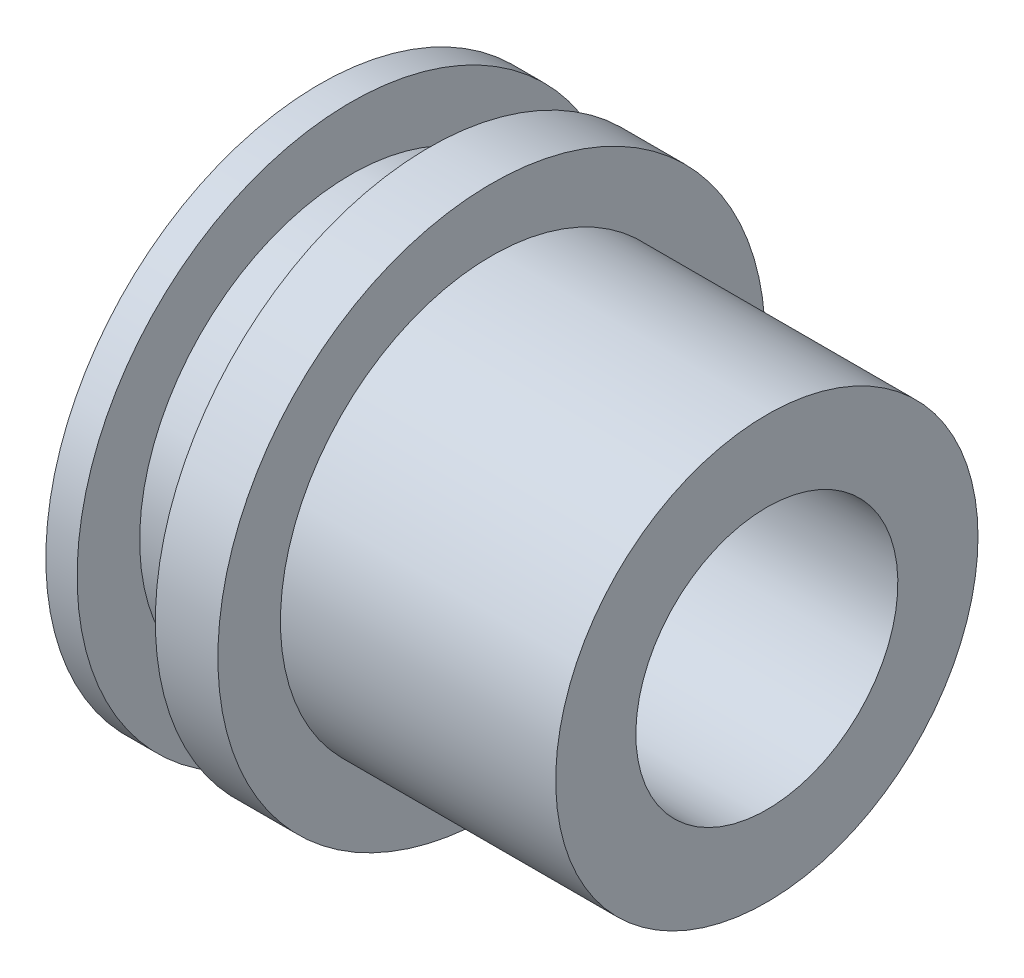
ISO-10303-21;
HEADER;
FILE_DESCRIPTION(('STEP AP214'),'2;1');
FILE_NAME('part.step','',(''),(''),'','','');
FILE_SCHEMA(('AUTOMOTIVE_DESIGN { 1 0 10303 214 1 1 1 1 }'));
ENDSEC;
DATA;
#1=APPLICATION_CONTEXT('core data for automotive mechanical design processes');
#2=APPLICATION_PROTOCOL_DEFINITION('international standard','automotive_design',2000,#1);
#3=PRODUCT_CONTEXT('',#1,'mechanical');
#4=PRODUCT('Part','Part','',(#3));
#5=PRODUCT_RELATED_PRODUCT_CATEGORY('part','',(#4));
#6=PRODUCT_DEFINITION_FORMATION('','',#4);
#7=PRODUCT_DEFINITION_CONTEXT('part definition',#1,'design');
#8=PRODUCT_DEFINITION('design','',#6,#7);
#9=PRODUCT_DEFINITION_SHAPE('','',#8);
#10=(LENGTH_UNIT() NAMED_UNIT(*) SI_UNIT(.MILLI.,.METRE.));
#11=(NAMED_UNIT(*) PLANE_ANGLE_UNIT() SI_UNIT($,.RADIAN.));
#12=(NAMED_UNIT(*) SI_UNIT($,.STERADIAN.) SOLID_ANGLE_UNIT());
#13=UNCERTAINTY_MEASURE_WITH_UNIT(LENGTH_MEASURE(1.E-05),#10,'distance_accuracy_value','');
#14=(GEOMETRIC_REPRESENTATION_CONTEXT(3) GLOBAL_UNCERTAINTY_ASSIGNED_CONTEXT((#13)) GLOBAL_UNIT_ASSIGNED_CONTEXT((#10,
#11,#12)) REPRESENTATION_CONTEXT('',''));
#15=CARTESIAN_POINT('',(0.,0.,0.));
#16=DIRECTION('',(0.,0.,1.));
#17=DIRECTION('',(1.,0.,0.));
#18=AXIS2_PLACEMENT_3D('',#15,#16,#17);
#19=CARTESIAN_POINT('',(0.499999999999999,0.,0.));
#20=DIRECTION('',(1.,0.,0.));
#21=DIRECTION('',(0.,0.,-1.));
#22=AXIS2_PLACEMENT_3D('',#19,#20,#21);
#23=CYLINDRICAL_SURFACE('',#22,8.75);
#24=CARTESIAN_POINT('',(0.,0.,0.));
#25=DIRECTION('',(1.,0.,0.));
#26=DIRECTION('',(0.,0.,-1.));
#27=AXIS2_PLACEMENT_3D('',#24,#25,#26);
#28=CIRCLE('',#27,8.75);
#29=CARTESIAN_POINT('',(0.,0.,-8.75));
#30=VERTEX_POINT('',#29);
#31=EDGE_CURVE('E19',#30,#30,#28,.F.);
#32=ORIENTED_EDGE('',*,*,#31,.F.);
#33=EDGE_LOOP('',(#32));
#34=FACE_BOUND('',#33,.T.);
#35=CARTESIAN_POINT('',(0.999999999999999,0.,0.));
#36=DIRECTION('',(1.,0.,0.));
#37=DIRECTION('',(0.,0.,-1.));
#38=AXIS2_PLACEMENT_3D('',#35,#36,#37);
#39=CIRCLE('',#38,8.75);
#40=CARTESIAN_POINT('',(0.999999999999999,0.,-8.75));
#41=VERTEX_POINT('',#40);
#42=EDGE_CURVE('E53',#41,#41,#39,.T.);
#43=ORIENTED_EDGE('',*,*,#42,.F.);
#44=EDGE_LOOP('',(#43));
#45=FACE_BOUND('',#44,.T.);
#46=ADVANCED_FACE('F15',(#34,#45),#23,.T.);
#47=CARTESIAN_POINT('',(0.,4.375,0.));
#48=DIRECTION('',(-1.,0.,0.));
#49=DIRECTION('',(0.,0.,1.));
#50=AXIS2_PLACEMENT_3D('',#47,#48,#49);
#51=PLANE('',#50);
#52=CARTESIAN_POINT('',(0.,0.,0.));
#53=DIRECTION('',(1.,0.,0.));
#54=DIRECTION('',(0.,0.,-1.));
#55=AXIS2_PLACEMENT_3D('',#52,#53,#54);
#56=CIRCLE('',#55,5.75);
#57=CARTESIAN_POINT('',(0.,0.,-5.75));
#58=VERTEX_POINT('',#57);
#59=EDGE_CURVE('E51',#58,#58,#56,.T.);
#60=ORIENTED_EDGE('',*,*,#59,.T.);
#61=EDGE_LOOP('',(#60));
#62=FACE_BOUND('',#61,.T.);
#63=ORIENTED_EDGE('',*,*,#31,.T.);
#64=EDGE_LOOP('',(#63));
#65=FACE_BOUND('',#64,.T.);
#66=ADVANCED_FACE('F60',(#62,#65),#51,.T.);
#67=CARTESIAN_POINT('',(0.999999999999999,7.75,0.));
#68=DIRECTION('',(1.,0.,0.));
#69=DIRECTION('',(0.,0.,-1.));
#70=AXIS2_PLACEMENT_3D('',#67,#68,#69);
#71=PLANE('',#70);
#72=CARTESIAN_POINT('',(0.999999999999999,0.,0.));
#73=DIRECTION('',(1.,0.,0.));
#74=DIRECTION('',(0.,0.,-1.));
#75=AXIS2_PLACEMENT_3D('',#72,#73,#74);
#76=CIRCLE('',#75,6.75);
#77=CARTESIAN_POINT('',(0.999999999999999,0.,-6.75));
#78=VERTEX_POINT('',#77);
#79=EDGE_CURVE('E48',#78,#78,#76,.T.);
#80=ORIENTED_EDGE('',*,*,#79,.F.);
#81=EDGE_LOOP('',(#80));
#82=FACE_BOUND('',#81,.T.);
#83=ORIENTED_EDGE('',*,*,#42,.T.);
#84=EDGE_LOOP('',(#83));
#85=FACE_BOUND('',#84,.T.);
#86=ADVANCED_FACE('F69',(#82,#85),#71,.T.);
#87=CARTESIAN_POINT('',(0.,0.,0.));
#88=DIRECTION('',(1.,0.,0.));
#89=DIRECTION('',(0.,0.,-1.));
#90=AXIS2_PLACEMENT_3D('',#87,#88,#89);
#91=CYLINDRICAL_SURFACE('',#90,5.75);
#92=CARTESIAN_POINT('',(4.5,0.,0.));
#93=DIRECTION('',(1.,0.,0.));
#94=DIRECTION('',(0.,0.,-1.));
#95=AXIS2_PLACEMENT_3D('',#92,#93,#94);
#96=CIRCLE('',#95,5.75);
#97=CARTESIAN_POINT('',(4.5,0.,-5.75));
#98=VERTEX_POINT('',#97);
#99=EDGE_CURVE('E45',#98,#98,#96,.T.);
#100=ORIENTED_EDGE('',*,*,#99,.T.);
#101=EDGE_LOOP('',(#100));
#102=FACE_BOUND('',#101,.T.);
#103=ORIENTED_EDGE('',*,*,#59,.F.);
#104=EDGE_LOOP('',(#103));
#105=FACE_BOUND('',#104,.T.);
#106=ADVANCED_FACE('F100',(#102,#105),#91,.F.);
#107=CARTESIAN_POINT('',(2.25,0.,0.));
#108=DIRECTION('',(1.,0.,0.));
#109=DIRECTION('',(0.,0.,-1.));
#110=AXIS2_PLACEMENT_3D('',#107,#108,#109);
#111=CYLINDRICAL_SURFACE('',#110,6.75);
#112=ORIENTED_EDGE('',*,*,#79,.T.);
#113=EDGE_LOOP('',(#112));
#114=FACE_BOUND('',#113,.T.);
#115=CARTESIAN_POINT('',(3.5,0.,0.));
#116=DIRECTION('',(1.,0.,0.));
#117=DIRECTION('',(0.,0.,-1.));
#118=AXIS2_PLACEMENT_3D('',#115,#116,#117);
#119=CIRCLE('',#118,6.75);
#120=CARTESIAN_POINT('',(3.5,0.,-6.75));
#121=VERTEX_POINT('',#120);
#122=EDGE_CURVE('E42',#121,#121,#119,.T.);
#123=ORIENTED_EDGE('',*,*,#122,.F.);
#124=EDGE_LOOP('',(#123));
#125=FACE_BOUND('',#124,.T.);
#126=ADVANCED_FACE('F97',(#114,#125),#111,.T.);
#127=CARTESIAN_POINT('',(4.5,5.865,-5.865));
#128=DIRECTION('',(1.,0.,0.));
#129=DIRECTION('',(0.,0.,1.));
#130=AXIS2_PLACEMENT_3D('',#127,#128,#129);
#131=PLANE('',#130);
#132=CARTESIAN_POINT('',(4.5,0.,0.));
#133=DIRECTION('',(1.,0.,0.));
#134=DIRECTION('',(0.,1.,0.));
#135=AXIS2_PLACEMENT_3D('',#132,#133,#134);
#136=CIRCLE('',#135,4.188);
#137=CARTESIAN_POINT('',(4.5,4.188,0.));
#138=VERTEX_POINT('',#137);
#139=EDGE_CURVE('E39',#138,#138,#136,.T.);
#140=ORIENTED_EDGE('',*,*,#139,.T.);
#141=EDGE_LOOP('',(#140));
#142=FACE_BOUND('',#141,.T.);
#143=ORIENTED_EDGE('',*,*,#99,.F.);
#144=EDGE_LOOP('',(#143));
#145=FACE_BOUND('',#144,.T.);
#146=ADVANCED_FACE('F95',(#142,#145),#131,.F.);
#147=CARTESIAN_POINT('',(3.5,7.75,0.));
#148=DIRECTION('',(-1.,0.,0.));
#149=DIRECTION('',(0.,0.,1.));
#150=AXIS2_PLACEMENT_3D('',#147,#148,#149);
#151=PLANE('',#150);
#152=ORIENTED_EDGE('',*,*,#122,.T.);
#153=EDGE_LOOP('',(#152));
#154=FACE_BOUND('',#153,.T.);
#155=CARTESIAN_POINT('',(3.5,0.,0.));
#156=DIRECTION('',(1.,0.,0.));
#157=DIRECTION('',(0.,0.,-1.));
#158=AXIS2_PLACEMENT_3D('',#155,#156,#157);
#159=CIRCLE('',#158,8.75);
#160=CARTESIAN_POINT('',(3.5,0.,-8.75));
#161=VERTEX_POINT('',#160);
#162=EDGE_CURVE('E36',#161,#161,#159,.T.);
#163=ORIENTED_EDGE('',*,*,#162,.F.);
#164=EDGE_LOOP('',(#163));
#165=FACE_BOUND('',#164,.T.);
#166=ADVANCED_FACE('F92',(#154,#165),#151,.T.);
#167=CARTESIAN_POINT('',(4.5,0.,0.));
#168=DIRECTION('',(1.,0.,0.));
#169=DIRECTION('',(0.,1.,0.));
#170=AXIS2_PLACEMENT_3D('',#167,#168,#169);
#171=CYLINDRICAL_SURFACE('',#170,4.188);
#172=ORIENTED_EDGE('',*,*,#139,.F.);
#173=EDGE_LOOP('',(#172));
#174=FACE_BOUND('',#173,.T.);
#175=CARTESIAN_POINT('',(14.3,0.,0.));
#176=DIRECTION('',(1.,0.,0.));
#177=DIRECTION('',(0.,1.,0.));
#178=AXIS2_PLACEMENT_3D('',#175,#176,#177);
#179=CIRCLE('',#178,4.188);
#180=CARTESIAN_POINT('',(14.3,4.188,0.));
#181=VERTEX_POINT('',#180);
#182=EDGE_CURVE('E33',#181,#181,#179,.F.);
#183=ORIENTED_EDGE('',*,*,#182,.F.);
#184=EDGE_LOOP('',(#183));
#185=FACE_BOUND('',#184,.T.);
#186=ADVANCED_FACE('F17',(#174,#185),#171,.F.);
#187=CARTESIAN_POINT('',(4.5,0.,0.));
#188=DIRECTION('',(1.,0.,0.));
#189=DIRECTION('',(0.,0.,-1.));
#190=AXIS2_PLACEMENT_3D('',#187,#188,#189);
#191=CYLINDRICAL_SURFACE('',#190,8.75);
#192=ORIENTED_EDGE('',*,*,#162,.T.);
#193=EDGE_LOOP('',(#192));
#194=FACE_BOUND('',#193,.T.);
#195=CARTESIAN_POINT('',(5.5,0.,0.));
#196=DIRECTION('',(1.,0.,0.));
#197=DIRECTION('',(0.,0.,-1.));
#198=AXIS2_PLACEMENT_3D('',#195,#196,#197);
#199=CIRCLE('',#198,8.75);
#200=CARTESIAN_POINT('',(5.5,0.,-8.75));
#201=VERTEX_POINT('',#200);
#202=EDGE_CURVE('E28',#201,#201,#199,.T.);
#203=ORIENTED_EDGE('',*,*,#202,.F.);
#204=EDGE_LOOP('',(#203));
#205=FACE_BOUND('',#204,.T.);
#206=ADVANCED_FACE('F87',(#194,#205),#191,.T.);
#207=CARTESIAN_POINT('',(14.3,3.375,0.));
#208=DIRECTION('',(1.,0.,0.));
#209=DIRECTION('',(0.,0.,-1.));
#210=AXIS2_PLACEMENT_3D('',#207,#208,#209);
#211=PLANE('',#210);
#212=ORIENTED_EDGE('',*,*,#182,.T.);
#213=EDGE_LOOP('',(#212));
#214=FACE_BOUND('',#213,.T.);
#215=CARTESIAN_POINT('',(14.3,0.,0.));
#216=DIRECTION('',(1.,0.,0.));
#217=DIRECTION('',(0.,0.,-1.));
#218=AXIS2_PLACEMENT_3D('',#215,#216,#217);
#219=CIRCLE('',#218,6.75);
#220=CARTESIAN_POINT('',(14.3,0.,-6.75));
#221=VERTEX_POINT('',#220);
#222=EDGE_CURVE('E23',#221,#221,#219,.F.);
#223=ORIENTED_EDGE('',*,*,#222,.F.);
#224=EDGE_LOOP('',(#223));
#225=FACE_BOUND('',#224,.T.);
#226=ADVANCED_FACE('F80',(#214,#225),#211,.T.);
#227=CARTESIAN_POINT('',(5.5,7.75,0.));
#228=DIRECTION('',(1.,0.,0.));
#229=DIRECTION('',(0.,0.,-1.));
#230=AXIS2_PLACEMENT_3D('',#227,#228,#229);
#231=PLANE('',#230);
#232=CARTESIAN_POINT('',(5.5,0.,0.));
#233=DIRECTION('',(1.,0.,0.));
#234=DIRECTION('',(0.,0.,-1.));
#235=AXIS2_PLACEMENT_3D('',#232,#233,#234);
#236=CIRCLE('',#235,6.75);
#237=CARTESIAN_POINT('',(5.5,0.,-6.75));
#238=VERTEX_POINT('',#237);
#239=EDGE_CURVE('E10',#238,#238,#236,.T.);
#240=ORIENTED_EDGE('',*,*,#239,.F.);
#241=EDGE_LOOP('',(#240));
#242=FACE_BOUND('',#241,.T.);
#243=ORIENTED_EDGE('',*,*,#202,.T.);
#244=EDGE_LOOP('',(#243));
#245=FACE_BOUND('',#244,.T.);
#246=ADVANCED_FACE('F75',(#242,#245),#231,.T.);
#247=CARTESIAN_POINT('',(9.9,0.,0.));
#248=DIRECTION('',(1.,0.,0.));
#249=DIRECTION('',(0.,0.,-1.));
#250=AXIS2_PLACEMENT_3D('',#247,#248,#249);
#251=CYLINDRICAL_SURFACE('',#250,6.75);
#252=ORIENTED_EDGE('',*,*,#239,.T.);
#253=EDGE_LOOP('',(#252));
#254=FACE_BOUND('',#253,.T.);
#255=ORIENTED_EDGE('',*,*,#222,.T.);
#256=EDGE_LOOP('',(#255));
#257=FACE_BOUND('',#256,.T.);
#258=ADVANCED_FACE('F73',(#254,#257),#251,.T.);
#259=CLOSED_SHELL('',(#46,#66,#86,#106,#126,#146,#166,#186,#206,#226,#246,#258));
#260=MANIFOLD_SOLID_BREP('B1',#259);
#261=ADVANCED_BREP_SHAPE_REPRESENTATION('',(#18,#260),#14);
#262=SHAPE_DEFINITION_REPRESENTATION(#9,#261);
ENDSEC;
END-ISO-10303-21;
